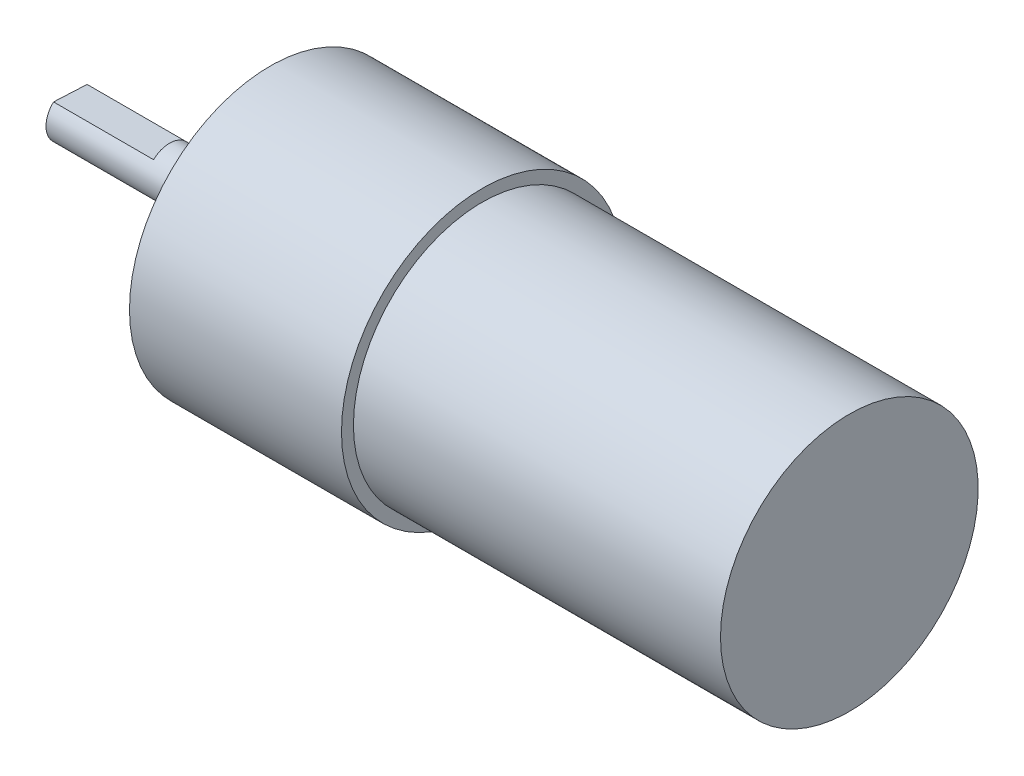
ISO-10303-21;
HEADER;
FILE_DESCRIPTION(('STEP AP214'),'2;1');
FILE_NAME('part.step','',(''),(''),'','','');
FILE_SCHEMA(('AUTOMOTIVE_DESIGN { 1 0 10303 214 1 1 1 1 }'));
ENDSEC;
DATA;
#1=APPLICATION_CONTEXT('core data for automotive mechanical design processes');
#2=APPLICATION_PROTOCOL_DEFINITION('international standard','automotive_design',2000,#1);
#3=PRODUCT_CONTEXT('',#1,'mechanical');
#4=PRODUCT('Part','Part','',(#3));
#5=PRODUCT_RELATED_PRODUCT_CATEGORY('part','',(#4));
#6=PRODUCT_DEFINITION_FORMATION('','',#4);
#7=PRODUCT_DEFINITION_CONTEXT('part definition',#1,'design');
#8=PRODUCT_DEFINITION('design','',#6,#7);
#9=PRODUCT_DEFINITION_SHAPE('','',#8);
#10=(LENGTH_UNIT() NAMED_UNIT(*) SI_UNIT(.MILLI.,.METRE.));
#11=(NAMED_UNIT(*) PLANE_ANGLE_UNIT() SI_UNIT($,.RADIAN.));
#12=(NAMED_UNIT(*) SI_UNIT($,.STERADIAN.) SOLID_ANGLE_UNIT());
#13=UNCERTAINTY_MEASURE_WITH_UNIT(LENGTH_MEASURE(1.E-05),#10,'distance_accuracy_value','');
#14=(GEOMETRIC_REPRESENTATION_CONTEXT(3) GLOBAL_UNCERTAINTY_ASSIGNED_CONTEXT((#13)) GLOBAL_UNIT_ASSIGNED_CONTEXT((#10,
#11,#12)) REPRESENTATION_CONTEXT('',''));
#15=CARTESIAN_POINT('',(0.,0.,0.));
#16=DIRECTION('',(0.,0.,1.));
#17=DIRECTION('',(1.,0.,0.));
#18=AXIS2_PLACEMENT_3D('',#15,#16,#17);
#19=CARTESIAN_POINT('',(24.5556478405316,0.,0.));
#20=DIRECTION('',(-1.,0.,0.));
#21=DIRECTION('',(0.,0.,1.));
#22=AXIS2_PLACEMENT_3D('',#19,#20,#21);
#23=PLANE('',#22);
#24=CARTESIAN_POINT('',(24.5556478405316,0.,0.));
#25=DIRECTION('',(-1.,0.,0.));
#26=DIRECTION('',(0.,0.,1.));
#27=AXIS2_PLACEMENT_3D('',#24,#25,#26);
#28=CIRCLE('',#27,10.95);
#29=CARTESIAN_POINT('',(24.5556478405316,0.,10.95));
#30=VERTEX_POINT('',#29);
#31=EDGE_CURVE('E11',#30,#30,#28,.T.);
#32=ORIENTED_EDGE('',*,*,#31,.F.);
#33=EDGE_LOOP('',(#32));
#34=FACE_BOUND('',#33,.T.);
#35=ADVANCED_FACE('F33',(#34),#23,.F.);
#36=CARTESIAN_POINT('',(-41.7243521594684,0.,0.));
#37=DIRECTION('',(-1.,0.,0.));
#38=DIRECTION('',(0.,0.,1.));
#39=AXIS2_PLACEMENT_3D('',#36,#37,#38);
#40=CYLINDRICAL_SURFACE('',#39,10.95);
#41=CARTESIAN_POINT('',(-6.64435215946843,0.,0.));
#42=DIRECTION('',(-1.,0.,0.));
#43=DIRECTION('',(0.,0.,1.));
#44=AXIS2_PLACEMENT_3D('',#41,#42,#43);
#45=CIRCLE('',#44,10.95);
#46=CARTESIAN_POINT('',(-6.64435215946843,0.,10.95));
#47=VERTEX_POINT('',#46);
#48=EDGE_CURVE('E40',#47,#47,#45,.T.);
#49=ORIENTED_EDGE('',*,*,#48,.F.);
#50=EDGE_LOOP('',(#49));
#51=FACE_BOUND('',#50,.T.);
#52=ORIENTED_EDGE('',*,*,#31,.T.);
#53=EDGE_LOOP('',(#52));
#54=FACE_BOUND('',#53,.T.);
#55=ADVANCED_FACE('F107',(#51,#54),#40,.T.);
#56=CARTESIAN_POINT('',(-6.64435215946843,0.,-10.95));
#57=DIRECTION('',(-1.,0.,0.));
#58=DIRECTION('',(0.,0.,1.));
#59=AXIS2_PLACEMENT_3D('',#56,#57,#58);
#60=PLANE('',#59);
#61=CARTESIAN_POINT('',(-6.64435215946843,0.,0.));
#62=DIRECTION('',(-1.,0.,0.));
#63=DIRECTION('',(0.,0.,1.));
#64=AXIS2_PLACEMENT_3D('',#61,#62,#63);
#65=CIRCLE('',#64,11.965);
#66=CARTESIAN_POINT('',(-6.64435215946843,0.,11.965));
#67=VERTEX_POINT('',#66);
#68=EDGE_CURVE('E100',#67,#67,#65,.T.);
#69=ORIENTED_EDGE('',*,*,#68,.F.);
#70=EDGE_LOOP('',(#69));
#71=FACE_BOUND('',#70,.T.);
#72=ORIENTED_EDGE('',*,*,#48,.T.);
#73=EDGE_LOOP('',(#72));
#74=FACE_BOUND('',#73,.T.);
#75=ADVANCED_FACE('F105',(#71,#74),#60,.F.);
#76=CARTESIAN_POINT('',(-41.7243521594684,0.,0.));
#77=DIRECTION('',(-1.,0.,0.));
#78=DIRECTION('',(0.,0.,1.));
#79=AXIS2_PLACEMENT_3D('',#76,#77,#78);
#80=CYLINDRICAL_SURFACE('',#79,11.965);
#81=CARTESIAN_POINT('',(-24.6643521594684,0.,0.));
#82=DIRECTION('',(-1.,0.,0.));
#83=DIRECTION('',(0.,0.,1.));
#84=AXIS2_PLACEMENT_3D('',#81,#82,#83);
#85=CIRCLE('',#84,11.965);
#86=CARTESIAN_POINT('',(-24.6643521594684,0.,11.965));
#87=VERTEX_POINT('',#86);
#88=EDGE_CURVE('E97',#87,#87,#85,.T.);
#89=ORIENTED_EDGE('',*,*,#88,.F.);
#90=EDGE_LOOP('',(#89));
#91=FACE_BOUND('',#90,.T.);
#92=ORIENTED_EDGE('',*,*,#68,.T.);
#93=EDGE_LOOP('',(#92));
#94=FACE_BOUND('',#93,.T.);
#95=ADVANCED_FACE('F125',(#91,#94),#80,.T.);
#96=CARTESIAN_POINT('',(-24.6643521594684,0.,-11.965));
#97=DIRECTION('',(1.,0.,0.));
#98=DIRECTION('',(0.,0.,-1.));
#99=AXIS2_PLACEMENT_3D('',#96,#97,#98);
#100=PLANE('',#99);
#101=CARTESIAN_POINT('',(-24.6643521594684,-1.83030008199672,8.22820362796012));
#102=DIRECTION('',(-1.,0.,0.));
#103=DIRECTION('',(0.,0.,1.));
#104=AXIS2_PLACEMENT_3D('',#101,#102,#103);
#105=CIRCLE('',#104,1.);
#106=CARTESIAN_POINT('',(-24.6643521594684,-1.83030008199672,9.22820362796012));
#107=VERTEX_POINT('',#106);
#108=EDGE_CURVE('E304',#107,#107,#105,.T.);
#109=ORIENTED_EDGE('',*,*,#108,.F.);
#110=EDGE_LOOP('',(#109));
#111=FACE_BOUND('',#110,.T.);
#112=CARTESIAN_POINT('',(-24.6643521594684,-6.21068332832638,-5.69918818153797));
#113=DIRECTION('',(-1.,0.,0.));
#114=DIRECTION('',(0.,0.,1.));
#115=AXIS2_PLACEMENT_3D('',#112,#113,#114);
#116=CIRCLE('',#115,1.);
#117=CARTESIAN_POINT('',(-24.6643521594684,-6.21068332832638,-4.69918818153797));
#118=VERTEX_POINT('',#117);
#119=EDGE_CURVE('E303',#118,#118,#116,.T.);
#120=ORIENTED_EDGE('',*,*,#119,.F.);
#121=EDGE_LOOP('',(#120));
#122=FACE_BOUND('',#121,.T.);
#123=CARTESIAN_POINT('',(-24.6643521594684,8.04098341032311,-2.52901544642216));
#124=DIRECTION('',(-1.,0.,0.));
#125=DIRECTION('',(0.,0.,1.));
#126=AXIS2_PLACEMENT_3D('',#123,#124,#125);
#127=CIRCLE('',#126,1.);
#128=CARTESIAN_POINT('',(-24.6643521594684,8.04098341032311,-1.52901544642216));
#129=VERTEX_POINT('',#128);
#130=EDGE_CURVE('E313',#129,#129,#127,.T.);
#131=ORIENTED_EDGE('',*,*,#130,.F.);
#132=EDGE_LOOP('',(#131));
#133=FACE_BOUND('',#132,.T.);
#134=CARTESIAN_POINT('',(-24.6643521594684,0.,0.));
#135=DIRECTION('',(-1.,0.,0.));
#136=DIRECTION('',(0.,0.,1.));
#137=AXIS2_PLACEMENT_3D('',#134,#135,#136);
#138=CIRCLE('',#137,4.97);
#139=CARTESIAN_POINT('',(-24.6643521594684,0.,4.97));
#140=VERTEX_POINT('',#139);
#141=EDGE_CURVE('E94',#140,#140,#138,.T.);
#142=ORIENTED_EDGE('',*,*,#141,.F.);
#143=EDGE_LOOP('',(#142));
#144=FACE_BOUND('',#143,.T.);
#145=ORIENTED_EDGE('',*,*,#88,.T.);
#146=EDGE_LOOP('',(#145));
#147=FACE_BOUND('',#146,.T.);
#148=ADVANCED_FACE('F133',(#111,#122,#133,#144,#147),#100,.F.);
#149=CARTESIAN_POINT('',(-41.7243521594684,0.,0.));
#150=DIRECTION('',(-1.,0.,0.));
#151=DIRECTION('',(0.,0.,1.));
#152=AXIS2_PLACEMENT_3D('',#149,#150,#151);
#153=CYLINDRICAL_SURFACE('',#152,4.97);
#154=CARTESIAN_POINT('',(-27.4943521594684,0.,0.));
#155=DIRECTION('',(-1.,0.,0.));
#156=DIRECTION('',(0.,0.,1.));
#157=AXIS2_PLACEMENT_3D('',#154,#155,#156);
#158=CIRCLE('',#157,4.97);
#159=CARTESIAN_POINT('',(-27.4943521594684,0.,4.97));
#160=VERTEX_POINT('',#159);
#161=EDGE_CURVE('E91',#160,#160,#158,.T.);
#162=ORIENTED_EDGE('',*,*,#161,.F.);
#163=EDGE_LOOP('',(#162));
#164=FACE_BOUND('',#163,.T.);
#165=ORIENTED_EDGE('',*,*,#141,.T.);
#166=EDGE_LOOP('',(#165));
#167=FACE_BOUND('',#166,.T.);
#168=ADVANCED_FACE('F143',(#164,#167),#153,.T.);
#169=CARTESIAN_POINT('',(-27.4943521594684,0.,-4.97));
#170=DIRECTION('',(1.,0.,0.));
#171=DIRECTION('',(0.,0.,-1.));
#172=AXIS2_PLACEMENT_3D('',#169,#170,#171);
#173=PLANE('',#172);
#174=CARTESIAN_POINT('',(-27.4943521594684,0.,0.));
#175=DIRECTION('',(-1.,0.,0.));
#176=DIRECTION('',(0.,0.,1.));
#177=AXIS2_PLACEMENT_3D('',#174,#175,#176);
#178=CIRCLE('',#177,3.965);
#179=CARTESIAN_POINT('',(-27.4943521594684,0.,3.965));
#180=VERTEX_POINT('',#179);
#181=EDGE_CURVE('E88',#180,#180,#178,.T.);
#182=ORIENTED_EDGE('',*,*,#181,.F.);
#183=EDGE_LOOP('',(#182));
#184=FACE_BOUND('',#183,.T.);
#185=ORIENTED_EDGE('',*,*,#161,.T.);
#186=EDGE_LOOP('',(#185));
#187=FACE_BOUND('',#186,.T.);
#188=ADVANCED_FACE('F154',(#184,#187),#173,.F.);
#189=CARTESIAN_POINT('',(-41.7243521594684,0.,0.));
#190=DIRECTION('',(-1.,0.,0.));
#191=DIRECTION('',(0.,0.,1.));
#192=AXIS2_PLACEMENT_3D('',#189,#190,#191);
#193=CYLINDRICAL_SURFACE('',#192,3.965);
#194=CARTESIAN_POINT('',(-28.2243521594684,0.,0.));
#195=DIRECTION('',(-1.,0.,0.));
#196=DIRECTION('',(0.,0.,1.));
#197=AXIS2_PLACEMENT_3D('',#194,#195,#196);
#198=CIRCLE('',#197,3.965);
#199=CARTESIAN_POINT('',(-28.2243521594684,0.,3.965));
#200=VERTEX_POINT('',#199);
#201=EDGE_CURVE('E85',#200,#200,#198,.T.);
#202=ORIENTED_EDGE('',*,*,#201,.F.);
#203=EDGE_LOOP('',(#202));
#204=FACE_BOUND('',#203,.T.);
#205=ORIENTED_EDGE('',*,*,#181,.T.);
#206=EDGE_LOOP('',(#205));
#207=FACE_BOUND('',#206,.T.);
#208=ADVANCED_FACE('F161',(#204,#207),#193,.T.);
#209=CARTESIAN_POINT('',(-28.2243521594684,0.,-3.965));
#210=DIRECTION('',(1.,0.,0.));
#211=DIRECTION('',(0.,0.,-1.));
#212=AXIS2_PLACEMENT_3D('',#209,#210,#211);
#213=PLANE('',#212);
#214=CARTESIAN_POINT('',(-28.2243521594684,0.,0.));
#215=DIRECTION('',(-1.,0.,0.));
#216=DIRECTION('',(0.,0.,1.));
#217=AXIS2_PLACEMENT_3D('',#214,#215,#216);
#218=CIRCLE('',#217,3.2);
#219=CARTESIAN_POINT('',(-28.2243521594684,0.,3.2));
#220=VERTEX_POINT('',#219);
#221=EDGE_CURVE('E82',#220,#220,#218,.T.);
#222=ORIENTED_EDGE('',*,*,#221,.F.);
#223=EDGE_LOOP('',(#222));
#224=FACE_BOUND('',#223,.T.);
#225=ORIENTED_EDGE('',*,*,#201,.T.);
#226=EDGE_LOOP('',(#225));
#227=FACE_BOUND('',#226,.T.);
#228=ADVANCED_FACE('F169',(#224,#227),#213,.F.);
#229=CARTESIAN_POINT('',(-41.7243521594684,0.,0.));
#230=DIRECTION('',(-1.,0.,0.));
#231=DIRECTION('',(0.,0.,1.));
#232=AXIS2_PLACEMENT_3D('',#229,#230,#231);
#233=CYLINDRICAL_SURFACE('',#232,3.2);
#234=CARTESIAN_POINT('',(-28.8243521594684,0.,0.));
#235=DIRECTION('',(-1.,0.,0.));
#236=DIRECTION('',(0.,0.,1.));
#237=AXIS2_PLACEMENT_3D('',#234,#235,#236);
#238=CIRCLE('',#237,3.2);
#239=CARTESIAN_POINT('',(-28.8243521594684,0.,3.2));
#240=VERTEX_POINT('',#239);
#241=EDGE_CURVE('E76',#240,#240,#238,.T.);
#242=ORIENTED_EDGE('',*,*,#241,.F.);
#243=EDGE_LOOP('',(#242));
#244=FACE_BOUND('',#243,.T.);
#245=ORIENTED_EDGE('',*,*,#221,.T.);
#246=EDGE_LOOP('',(#245));
#247=FACE_BOUND('',#246,.T.);
#248=ADVANCED_FACE('F177',(#244,#247),#233,.T.);
#249=CARTESIAN_POINT('',(-28.8243521594684,0.,-3.2));
#250=DIRECTION('',(1.,0.,0.));
#251=DIRECTION('',(0.,0.,-1.));
#252=AXIS2_PLACEMENT_3D('',#249,#250,#251);
#253=PLANE('',#252);
#254=CARTESIAN_POINT('',(-28.8243521594684,0.,0.));
#255=DIRECTION('',(-1.,0.,0.));
#256=DIRECTION('',(0.,0.,1.));
#257=AXIS2_PLACEMENT_3D('',#254,#255,#256);
#258=CIRCLE('',#257,2.);
#259=CARTESIAN_POINT('',(-28.8243521594684,0.,2.));
#260=VERTEX_POINT('',#259);
#261=EDGE_CURVE('E73',#260,#260,#258,.T.);
#262=ORIENTED_EDGE('',*,*,#261,.F.);
#263=EDGE_LOOP('',(#262));
#264=FACE_BOUND('',#263,.T.);
#265=ORIENTED_EDGE('',*,*,#241,.T.);
#266=EDGE_LOOP('',(#265));
#267=FACE_BOUND('',#266,.T.);
#268=ADVANCED_FACE('F185',(#264,#267),#253,.F.);
#269=CARTESIAN_POINT('',(-41.7243521594684,0.,0.));
#270=DIRECTION('',(-1.,0.,0.));
#271=DIRECTION('',(0.,0.,1.));
#272=AXIS2_PLACEMENT_3D('',#269,#270,#271);
#273=CYLINDRICAL_SURFACE('',#272,2.);
#274=CARTESIAN_POINT('',(-33.2243521594684,0.,0.));
#275=DIRECTION('',(-1.,0.,0.));
#276=DIRECTION('',(0.,0.,1.));
#277=AXIS2_PLACEMENT_3D('',#274,#275,#276);
#278=CIRCLE('',#277,2.);
#279=CARTESIAN_POINT('',(-33.2243521594684,1.46703584056804,1.35934022322921));
#280=VERTEX_POINT('',#279);
#281=CARTESIAN_POINT('',(-33.2243521594684,1.32972761118096,-1.49392920851792));
#282=VERTEX_POINT('',#281);
#283=EDGE_CURVE('E63',#280,#282,#278,.T.);
#284=ORIENTED_EDGE('',*,*,#283,.F.);
#285=DIRECTION('',(-1.,0.,0.));
#286=VECTOR('',#285,1.);
#287=CARTESIAN_POINT('',(-33.2243521594684,1.46703584056804,1.35934022322921));
#288=LINE('',#287,#286);
#289=CARTESIAN_POINT('',(-41.7243521594684,1.46703584056804,1.35934022322921));
#290=VERTEX_POINT('',#289);
#291=EDGE_CURVE('E53',#280,#290,#288,.T.);
#292=ORIENTED_EDGE('',*,*,#291,.T.);
#293=CARTESIAN_POINT('',(-41.7243521594684,0.,0.));
#294=DIRECTION('',(-1.,0.,0.));
#295=DIRECTION('',(0.,0.,1.));
#296=AXIS2_PLACEMENT_3D('',#293,#294,#295);
#297=CIRCLE('',#296,2.);
#298=CARTESIAN_POINT('',(-41.7243521594684,1.32972761118096,-1.49392920851792));
#299=VERTEX_POINT('',#298);
#300=EDGE_CURVE('E70',#299,#290,#297,.T.);
#301=ORIENTED_EDGE('',*,*,#300,.F.);
#302=DIRECTION('',(-1.,0.,0.));
#303=VECTOR('',#302,1.);
#304=CARTESIAN_POINT('',(-33.2243521594684,1.32972761118096,-1.49392920851792));
#305=LINE('',#304,#303);
#306=EDGE_CURVE('E47',#282,#299,#305,.T.);
#307=ORIENTED_EDGE('',*,*,#306,.F.);
#308=EDGE_LOOP('',(#284,#292,#301,#307));
#309=FACE_BOUND('',#308,.T.);
#310=ORIENTED_EDGE('',*,*,#261,.T.);
#311=EDGE_LOOP('',(#310));
#312=FACE_BOUND('',#311,.T.);
#313=ADVANCED_FACE('F68',(#309,#312),#273,.T.);
#314=CARTESIAN_POINT('',(-41.7243521594684,0.,-2.));
#315=DIRECTION('',(1.,0.,0.));
#316=DIRECTION('',(0.,0.,-1.));
#317=AXIS2_PLACEMENT_3D('',#314,#315,#316);
#318=PLANE('',#317);
#319=ORIENTED_EDGE('',*,*,#300,.T.);
#320=DIRECTION('',(0.,0.0480674947459688,0.998844089910355));
#321=VECTOR('',#320,1.);
#322=CARTESIAN_POINT('',(-41.7243521594684,1.32972761118096,-1.49392920851792));
#323=LINE('',#322,#321);
#324=EDGE_CURVE('E58',#299,#290,#323,.T.);
#325=ORIENTED_EDGE('',*,*,#324,.F.);
#326=EDGE_LOOP('',(#319,#325));
#327=FACE_BOUND('',#326,.T.);
#328=ADVANCED_FACE('F72',(#327),#318,.F.);
#329=CARTESIAN_POINT('',(-33.2243521594684,1.32972761118096,-1.49392920851792));
#330=DIRECTION('',(0.,-0.998844089910355,0.0480674947459688));
#331=DIRECTION('',(0.,-0.0480674947459688,-0.998844089910355));
#332=AXIS2_PLACEMENT_3D('',#329,#330,#331);
#333=PLANE('',#332);
#334=ORIENTED_EDGE('',*,*,#324,.T.);
#335=ORIENTED_EDGE('',*,*,#291,.F.);
#336=DIRECTION('',(0.,0.0480674947459688,0.998844089910355));
#337=VECTOR('',#336,1.);
#338=CARTESIAN_POINT('',(-33.2243521594684,1.32972761118096,-1.49392920851792));
#339=LINE('',#338,#337);
#340=EDGE_CURVE('E320',#282,#280,#339,.T.);
#341=ORIENTED_EDGE('',*,*,#340,.F.);
#342=ORIENTED_EDGE('',*,*,#306,.T.);
#343=EDGE_LOOP('',(#334,#335,#341,#342));
#344=FACE_BOUND('',#343,.T.);
#345=ADVANCED_FACE('F59',(#344),#333,.F.);
#346=CARTESIAN_POINT('',(-33.2243521594684,0.,0.));
#347=DIRECTION('',(-1.,0.,0.));
#348=DIRECTION('',(0.,0.,1.));
#349=AXIS2_PLACEMENT_3D('',#346,#347,#348);
#350=PLANE('',#349);
#351=ORIENTED_EDGE('',*,*,#283,.T.);
#352=ORIENTED_EDGE('',*,*,#340,.T.);
#353=EDGE_LOOP('',(#351,#352));
#354=FACE_BOUND('',#353,.T.);
#355=ADVANCED_FACE('F212',(#354),#350,.T.);
#356=CARTESIAN_POINT('',(-14.6643521594684,8.04098341032311,-2.52901544642216));
#357=DIRECTION('',(-1.,0.,0.));
#358=DIRECTION('',(0.,0.,1.));
#359=AXIS2_PLACEMENT_3D('',#356,#357,#358);
#360=CYLINDRICAL_SURFACE('',#359,1.);
#361=CARTESIAN_POINT('',(-14.6643521594684,8.04098341032311,-2.52901544642216));
#362=DIRECTION('',(-1.,0.,0.));
#363=DIRECTION('',(0.,0.,1.));
#364=AXIS2_PLACEMENT_3D('',#361,#362,#363);
#365=CIRCLE('',#364,1.);
#366=CARTESIAN_POINT('',(-14.6643521594684,8.04098341032311,-1.52901544642216));
#367=VERTEX_POINT('',#366);
#368=EDGE_CURVE('E64',#367,#367,#365,.T.);
#369=ORIENTED_EDGE('',*,*,#368,.F.);
#370=EDGE_LOOP('',(#369));
#371=FACE_BOUND('',#370,.T.);
#372=ORIENTED_EDGE('',*,*,#130,.T.);
#373=EDGE_LOOP('',(#372));
#374=FACE_BOUND('',#373,.T.);
#375=ADVANCED_FACE('F218',(#371,#374),#360,.F.);
#376=CARTESIAN_POINT('',(-14.6643521594684,0.,0.));
#377=DIRECTION('',(-1.,0.,0.));
#378=DIRECTION('',(0.,0.,1.));
#379=AXIS2_PLACEMENT_3D('',#376,#377,#378);
#380=PLANE('',#379);
#381=ORIENTED_EDGE('',*,*,#368,.T.);
#382=EDGE_LOOP('',(#381));
#383=FACE_BOUND('',#382,.T.);
#384=ADVANCED_FACE('F225',(#383),#380,.T.);
#385=CARTESIAN_POINT('',(-14.6643521594684,-6.21068332832638,-5.69918818153797));
#386=DIRECTION('',(-1.,0.,0.));
#387=DIRECTION('',(0.,0.,1.));
#388=AXIS2_PLACEMENT_3D('',#385,#386,#387);
#389=CYLINDRICAL_SURFACE('',#388,1.);
#390=CARTESIAN_POINT('',(-14.6643521594684,-6.21068332832638,-5.69918818153797));
#391=DIRECTION('',(-1.,0.,0.));
#392=DIRECTION('',(0.,0.,1.));
#393=AXIS2_PLACEMENT_3D('',#390,#391,#392);
#394=CIRCLE('',#393,1.);
#395=CARTESIAN_POINT('',(-14.6643521594684,-6.21068332832638,-4.69918818153797));
#396=VERTEX_POINT('',#395);
#397=EDGE_CURVE('E307',#396,#396,#394,.T.);
#398=ORIENTED_EDGE('',*,*,#397,.F.);
#399=EDGE_LOOP('',(#398));
#400=FACE_BOUND('',#399,.T.);
#401=ORIENTED_EDGE('',*,*,#119,.T.);
#402=EDGE_LOOP('',(#401));
#403=FACE_BOUND('',#402,.T.);
#404=ADVANCED_FACE('F233',(#400,#403),#389,.F.);
#405=CARTESIAN_POINT('',(-14.6643521594684,0.,0.));
#406=DIRECTION('',(-1.,0.,0.));
#407=DIRECTION('',(0.,0.,1.));
#408=AXIS2_PLACEMENT_3D('',#405,#406,#407);
#409=PLANE('',#408);
#410=ORIENTED_EDGE('',*,*,#397,.T.);
#411=EDGE_LOOP('',(#410));
#412=FACE_BOUND('',#411,.T.);
#413=ADVANCED_FACE('F241',(#412),#409,.T.);
#414=CARTESIAN_POINT('',(-14.6643521594684,-1.83030008199672,8.22820362796012));
#415=DIRECTION('',(-1.,0.,0.));
#416=DIRECTION('',(0.,0.,1.));
#417=AXIS2_PLACEMENT_3D('',#414,#415,#416);
#418=CYLINDRICAL_SURFACE('',#417,1.);
#419=CARTESIAN_POINT('',(-14.6643521594684,-1.83030008199672,8.22820362796012));
#420=DIRECTION('',(-1.,0.,0.));
#421=DIRECTION('',(0.,0.,1.));
#422=AXIS2_PLACEMENT_3D('',#419,#420,#421);
#423=CIRCLE('',#422,1.);
#424=CARTESIAN_POINT('',(-14.6643521594684,-1.83030008199672,9.22820362796012));
#425=VERTEX_POINT('',#424);
#426=EDGE_CURVE('E302',#425,#425,#423,.T.);
#427=ORIENTED_EDGE('',*,*,#426,.F.);
#428=EDGE_LOOP('',(#427));
#429=FACE_BOUND('',#428,.T.);
#430=ORIENTED_EDGE('',*,*,#108,.T.);
#431=EDGE_LOOP('',(#430));
#432=FACE_BOUND('',#431,.T.);
#433=ADVANCED_FACE('F249',(#429,#432),#418,.F.);
#434=CARTESIAN_POINT('',(-14.6643521594684,0.,0.));
#435=DIRECTION('',(-1.,0.,0.));
#436=DIRECTION('',(0.,0.,1.));
#437=AXIS2_PLACEMENT_3D('',#434,#435,#436);
#438=PLANE('',#437);
#439=ORIENTED_EDGE('',*,*,#426,.T.);
#440=EDGE_LOOP('',(#439));
#441=FACE_BOUND('',#440,.T.);
#442=ADVANCED_FACE('F257',(#441),#438,.T.);
#443=CLOSED_SHELL('',(#35,#55,#75,#95,#148,#168,#188,#208,#228,#248,#268,#313,#328,#345,#355,
#375,#384,#404,#413,#433,#442));
#444=MANIFOLD_SOLID_BREP('B2',#443);
#445=ADVANCED_BREP_SHAPE_REPRESENTATION('',(#18,#444),#14);
#446=SHAPE_DEFINITION_REPRESENTATION(#9,#445);
ENDSEC;
END-ISO-10303-21;
